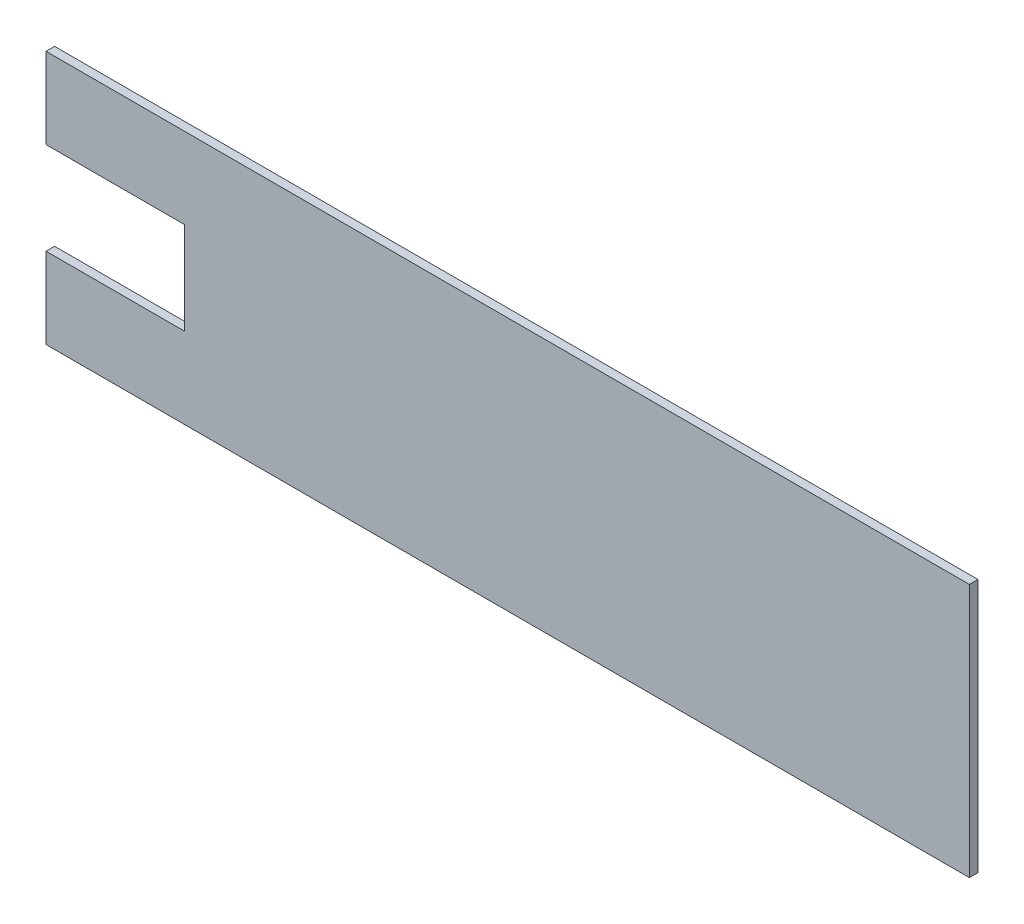
ISO-10303-21;
HEADER;
FILE_DESCRIPTION(('STEP AP214'),'2;1');
FILE_NAME('part.step','',(''),(''),'','','');
FILE_SCHEMA(('AUTOMOTIVE_DESIGN { 1 0 10303 214 1 1 1 1 }'));
ENDSEC;
DATA;
#1=APPLICATION_CONTEXT('core data for automotive mechanical design processes');
#2=APPLICATION_PROTOCOL_DEFINITION('international standard','automotive_design',2000,#1);
#3=PRODUCT_CONTEXT('',#1,'mechanical');
#4=PRODUCT('Part','Part','',(#3));
#5=PRODUCT_RELATED_PRODUCT_CATEGORY('part','',(#4));
#6=PRODUCT_DEFINITION_FORMATION('','',#4);
#7=PRODUCT_DEFINITION_CONTEXT('part definition',#1,'design');
#8=PRODUCT_DEFINITION('design','',#6,#7);
#9=PRODUCT_DEFINITION_SHAPE('','',#8);
#10=(LENGTH_UNIT() NAMED_UNIT(*) SI_UNIT(.MILLI.,.METRE.));
#11=(NAMED_UNIT(*) PLANE_ANGLE_UNIT() SI_UNIT($,.RADIAN.));
#12=(NAMED_UNIT(*) SI_UNIT($,.STERADIAN.) SOLID_ANGLE_UNIT());
#13=UNCERTAINTY_MEASURE_WITH_UNIT(LENGTH_MEASURE(1.E-05),#10,'distance_accuracy_value','');
#14=(GEOMETRIC_REPRESENTATION_CONTEXT(3) GLOBAL_UNCERTAINTY_ASSIGNED_CONTEXT((#13)) GLOBAL_UNIT_ASSIGNED_CONTEXT((#10,
#11,#12)) REPRESENTATION_CONTEXT('',''));
#15=CARTESIAN_POINT('',(0.,0.,0.));
#16=DIRECTION('',(0.,0.,1.));
#17=DIRECTION('',(1.,0.,0.));
#18=AXIS2_PLACEMENT_3D('',#15,#16,#17);
#19=CARTESIAN_POINT('',(0.,0.,2.3622));
#20=DIRECTION('',(1.,0.,0.));
#21=DIRECTION('',(0.,0.,-1.));
#22=AXIS2_PLACEMENT_3D('',#19,#20,#21);
#23=PLANE('',#22);
#24=DIRECTION('',(0.,-1.,0.));
#25=VECTOR('',#24,1.);
#26=CARTESIAN_POINT('',(0.,0.,0.));
#27=LINE('',#26,#25);
#28=CARTESIAN_POINT('',(0.,69.85,0.));
#29=VERTEX_POINT('',#28);
#30=CARTESIAN_POINT('',(0.,47.625,0.));
#31=VERTEX_POINT('',#30);
#32=EDGE_CURVE('E141',#29,#31,#27,.T.);
#33=ORIENTED_EDGE('',*,*,#32,.T.);
#34=DIRECTION('',(0.,0.,1.));
#35=VECTOR('',#34,1.);
#36=CARTESIAN_POINT('',(0.,47.625,0.));
#37=LINE('',#36,#35);
#38=CARTESIAN_POINT('',(0.,47.625,2.3622));
#39=VERTEX_POINT('',#38);
#40=EDGE_CURVE('E142',#31,#39,#37,.T.);
#41=ORIENTED_EDGE('',*,*,#40,.T.);
#42=DIRECTION('',(0.,-1.,0.));
#43=VECTOR('',#42,1.);
#44=CARTESIAN_POINT('',(0.,0.,2.3622));
#45=LINE('',#44,#43);
#46=CARTESIAN_POINT('',(0.,69.85,2.3622));
#47=VERTEX_POINT('',#46);
#48=EDGE_CURVE('E178',#47,#39,#45,.T.);
#49=ORIENTED_EDGE('',*,*,#48,.F.);
#50=DIRECTION('',(0.,0.,-1.));
#51=VECTOR('',#50,1.);
#52=CARTESIAN_POINT('',(0.,69.85,2.3622));
#53=LINE('',#52,#51);
#54=EDGE_CURVE('E160',#47,#29,#53,.T.);
#55=ORIENTED_EDGE('',*,*,#54,.T.);
#56=EDGE_LOOP('',(#33,#41,#49,#55));
#57=FACE_BOUND('',#56,.T.);
#58=ADVANCED_FACE('F43',(#57),#23,.F.);
#59=CARTESIAN_POINT('',(0.,22.225,2.3622));
#60=VERTEX_POINT('',#59);
#61=CARTESIAN_POINT('',(0.,0.,2.3622));
#62=VERTEX_POINT('',#61);
#63=EDGE_CURVE('E96',#60,#62,#45,.T.);
#64=ORIENTED_EDGE('',*,*,#63,.F.);
#65=DIRECTION('',(0.,0.,1.));
#66=VECTOR('',#65,1.);
#67=CARTESIAN_POINT('',(0.,22.225,0.));
#68=LINE('',#67,#66);
#69=CARTESIAN_POINT('',(0.,22.225,0.));
#70=VERTEX_POINT('',#69);
#71=EDGE_CURVE('E122',#70,#60,#68,.T.);
#72=ORIENTED_EDGE('',*,*,#71,.F.);
#73=CARTESIAN_POINT('',(0.,0.,0.));
#74=VERTEX_POINT('',#73);
#75=EDGE_CURVE('E131',#70,#74,#27,.T.);
#76=ORIENTED_EDGE('',*,*,#75,.T.);
#77=DIRECTION('',(0.,0.,-1.));
#78=VECTOR('',#77,1.);
#79=CARTESIAN_POINT('',(0.,0.,2.3622));
#80=LINE('',#79,#78);
#81=EDGE_CURVE('E11',#62,#74,#80,.T.);
#82=ORIENTED_EDGE('',*,*,#81,.F.);
#83=EDGE_LOOP('',(#64,#72,#76,#82));
#84=FACE_BOUND('',#83,.T.);
#85=ADVANCED_FACE('F45',(#84),#23,.F.);
#86=CARTESIAN_POINT('',(0.,0.,2.3622));
#87=DIRECTION('',(0.,1.,0.));
#88=DIRECTION('',(0.,0.,1.));
#89=AXIS2_PLACEMENT_3D('',#86,#87,#88);
#90=PLANE('',#89);
#91=DIRECTION('',(1.,0.,0.));
#92=VECTOR('',#91,1.);
#93=CARTESIAN_POINT('',(0.,0.,0.));
#94=LINE('',#93,#92);
#95=CARTESIAN_POINT('',(254.,0.,0.));
#96=VERTEX_POINT('',#95);
#97=EDGE_CURVE('E139',#74,#96,#94,.T.);
#98=ORIENTED_EDGE('',*,*,#97,.T.);
#99=DIRECTION('',(0.,0.,-1.));
#100=VECTOR('',#99,1.);
#101=CARTESIAN_POINT('',(254.,0.,2.3622));
#102=LINE('',#101,#100);
#103=CARTESIAN_POINT('',(254.,0.,2.3622));
#104=VERTEX_POINT('',#103);
#105=EDGE_CURVE('E52',#104,#96,#102,.T.);
#106=ORIENTED_EDGE('',*,*,#105,.F.);
#107=DIRECTION('',(1.,0.,0.));
#108=VECTOR('',#107,1.);
#109=CARTESIAN_POINT('',(0.,0.,2.3622));
#110=LINE('',#109,#108);
#111=EDGE_CURVE('E182',#62,#104,#110,.T.);
#112=ORIENTED_EDGE('',*,*,#111,.F.);
#113=ORIENTED_EDGE('',*,*,#81,.T.);
#114=EDGE_LOOP('',(#98,#106,#112,#113));
#115=FACE_BOUND('',#114,.T.);
#116=ADVANCED_FACE('F222',(#115),#90,.F.);
#117=CARTESIAN_POINT('',(254.,0.,2.3622));
#118=DIRECTION('',(-1.,0.,0.));
#119=DIRECTION('',(0.,0.,1.));
#120=AXIS2_PLACEMENT_3D('',#117,#118,#119);
#121=PLANE('',#120);
#122=DIRECTION('',(0.,1.,0.));
#123=VECTOR('',#122,1.);
#124=CARTESIAN_POINT('',(254.,0.,0.));
#125=LINE('',#124,#123);
#126=CARTESIAN_POINT('',(254.,69.85,0.));
#127=VERTEX_POINT('',#126);
#128=EDGE_CURVE('E155',#96,#127,#125,.T.);
#129=ORIENTED_EDGE('',*,*,#128,.T.);
#130=DIRECTION('',(0.,0.,-1.));
#131=VECTOR('',#130,1.);
#132=CARTESIAN_POINT('',(254.,69.85,2.3622));
#133=LINE('',#132,#131);
#134=CARTESIAN_POINT('',(254.,69.85,2.3622));
#135=VERTEX_POINT('',#134);
#136=EDGE_CURVE('E163',#135,#127,#133,.T.);
#137=ORIENTED_EDGE('',*,*,#136,.F.);
#138=DIRECTION('',(0.,1.,0.));
#139=VECTOR('',#138,1.);
#140=CARTESIAN_POINT('',(254.,0.,2.3622));
#141=LINE('',#140,#139);
#142=EDGE_CURVE('E172',#104,#135,#141,.T.);
#143=ORIENTED_EDGE('',*,*,#142,.F.);
#144=ORIENTED_EDGE('',*,*,#105,.T.);
#145=EDGE_LOOP('',(#129,#137,#143,#144));
#146=FACE_BOUND('',#145,.T.);
#147=ADVANCED_FACE('F170',(#146),#121,.F.);
#148=CARTESIAN_POINT('',(0.,69.85,2.3622));
#149=DIRECTION('',(0.,-1.,0.));
#150=DIRECTION('',(0.,0.,-1.));
#151=AXIS2_PLACEMENT_3D('',#148,#149,#150);
#152=PLANE('',#151);
#153=DIRECTION('',(-1.,0.,0.));
#154=VECTOR('',#153,1.);
#155=CARTESIAN_POINT('',(0.,69.85,0.));
#156=LINE('',#155,#154);
#157=EDGE_CURVE('E89',#127,#29,#156,.T.);
#158=ORIENTED_EDGE('',*,*,#157,.T.);
#159=ORIENTED_EDGE('',*,*,#54,.F.);
#160=DIRECTION('',(-1.,0.,0.));
#161=VECTOR('',#160,1.);
#162=CARTESIAN_POINT('',(0.,69.85,2.3622));
#163=LINE('',#162,#161);
#164=EDGE_CURVE('E68',#135,#47,#163,.T.);
#165=ORIENTED_EDGE('',*,*,#164,.F.);
#166=ORIENTED_EDGE('',*,*,#136,.T.);
#167=EDGE_LOOP('',(#158,#159,#165,#166));
#168=FACE_BOUND('',#167,.T.);
#169=ADVANCED_FACE('F179',(#168),#152,.F.);
#170=CARTESIAN_POINT('',(0.,0.,2.3622));
#171=DIRECTION('',(0.,0.,-1.));
#172=DIRECTION('',(-1.,0.,0.));
#173=AXIS2_PLACEMENT_3D('',#170,#171,#172);
#174=PLANE('',#173);
#175=ORIENTED_EDGE('',*,*,#48,.T.);
#176=DIRECTION('',(-1.,0.,0.));
#177=VECTOR('',#176,1.);
#178=CARTESIAN_POINT('',(0.,47.625,2.3622));
#179=LINE('',#178,#177);
#180=CARTESIAN_POINT('',(38.1,47.625,2.3622));
#181=VERTEX_POINT('',#180);
#182=EDGE_CURVE('E127',#181,#39,#179,.T.);
#183=ORIENTED_EDGE('',*,*,#182,.F.);
#184=DIRECTION('',(0.,1.,0.));
#185=VECTOR('',#184,1.);
#186=CARTESIAN_POINT('',(38.1,47.625,2.3622));
#187=LINE('',#186,#185);
#188=CARTESIAN_POINT('',(38.1,22.225,2.3622));
#189=VERTEX_POINT('',#188);
#190=EDGE_CURVE('E194',#189,#181,#187,.T.);
#191=ORIENTED_EDGE('',*,*,#190,.F.);
#192=DIRECTION('',(1.,0.,0.));
#193=VECTOR('',#192,1.);
#194=CARTESIAN_POINT('',(0.,22.225,2.3622));
#195=LINE('',#194,#193);
#196=EDGE_CURVE('E198',#60,#189,#195,.T.);
#197=ORIENTED_EDGE('',*,*,#196,.F.);
#198=ORIENTED_EDGE('',*,*,#63,.T.);
#199=ORIENTED_EDGE('',*,*,#111,.T.);
#200=ORIENTED_EDGE('',*,*,#142,.T.);
#201=ORIENTED_EDGE('',*,*,#164,.T.);
#202=EDGE_LOOP('',(#175,#183,#191,#197,#198,#199,#200,#201));
#203=FACE_BOUND('',#202,.T.);
#204=ADVANCED_FACE('F206',(#203),#174,.F.);
#205=CARTESIAN_POINT('',(0.,0.,0.));
#206=DIRECTION('',(0.,0.,-1.));
#207=DIRECTION('',(-1.,0.,0.));
#208=AXIS2_PLACEMENT_3D('',#205,#206,#207);
#209=PLANE('',#208);
#210=DIRECTION('',(-1.,0.,0.));
#211=VECTOR('',#210,1.);
#212=CARTESIAN_POINT('',(0.,47.625,0.));
#213=LINE('',#212,#211);
#214=CARTESIAN_POINT('',(38.1,47.625,0.));
#215=VERTEX_POINT('',#214);
#216=EDGE_CURVE('E134',#215,#31,#213,.T.);
#217=ORIENTED_EDGE('',*,*,#216,.T.);
#218=ORIENTED_EDGE('',*,*,#32,.F.);
#219=ORIENTED_EDGE('',*,*,#157,.F.);
#220=ORIENTED_EDGE('',*,*,#128,.F.);
#221=ORIENTED_EDGE('',*,*,#97,.F.);
#222=ORIENTED_EDGE('',*,*,#75,.F.);
#223=DIRECTION('',(1.,0.,0.));
#224=VECTOR('',#223,1.);
#225=CARTESIAN_POINT('',(0.,22.225,0.));
#226=LINE('',#225,#224);
#227=CARTESIAN_POINT('',(38.1,22.225,0.));
#228=VERTEX_POINT('',#227);
#229=EDGE_CURVE('E118',#70,#228,#226,.T.);
#230=ORIENTED_EDGE('',*,*,#229,.T.);
#231=DIRECTION('',(0.,1.,0.));
#232=VECTOR('',#231,1.);
#233=CARTESIAN_POINT('',(38.1,47.625,0.));
#234=LINE('',#233,#232);
#235=EDGE_CURVE('E59',#228,#215,#234,.T.);
#236=ORIENTED_EDGE('',*,*,#235,.T.);
#237=EDGE_LOOP('',(#217,#218,#219,#220,#221,#222,#230,#236));
#238=FACE_BOUND('',#237,.T.);
#239=ADVANCED_FACE('F137',(#238),#209,.T.);
#240=CARTESIAN_POINT('',(0.,47.625,0.));
#241=DIRECTION('',(0.,1.,0.));
#242=DIRECTION('',(0.,0.,1.));
#243=AXIS2_PLACEMENT_3D('',#240,#241,#242);
#244=PLANE('',#243);
#245=ORIENTED_EDGE('',*,*,#182,.T.);
#246=ORIENTED_EDGE('',*,*,#40,.F.);
#247=ORIENTED_EDGE('',*,*,#216,.F.);
#248=DIRECTION('',(0.,0.,1.));
#249=VECTOR('',#248,1.);
#250=CARTESIAN_POINT('',(38.1,47.625,0.));
#251=LINE('',#250,#249);
#252=EDGE_CURVE('E148',#215,#181,#251,.T.);
#253=ORIENTED_EDGE('',*,*,#252,.T.);
#254=EDGE_LOOP('',(#245,#246,#247,#253));
#255=FACE_BOUND('',#254,.T.);
#256=ADVANCED_FACE('F209',(#255),#244,.F.);
#257=CARTESIAN_POINT('',(38.1,47.625,0.));
#258=DIRECTION('',(1.,0.,0.));
#259=DIRECTION('',(0.,0.,-1.));
#260=AXIS2_PLACEMENT_3D('',#257,#258,#259);
#261=PLANE('',#260);
#262=ORIENTED_EDGE('',*,*,#190,.T.);
#263=ORIENTED_EDGE('',*,*,#252,.F.);
#264=ORIENTED_EDGE('',*,*,#235,.F.);
#265=DIRECTION('',(0.,0.,1.));
#266=VECTOR('',#265,1.);
#267=CARTESIAN_POINT('',(38.1,22.225,0.));
#268=LINE('',#267,#266);
#269=EDGE_CURVE('E123',#228,#189,#268,.T.);
#270=ORIENTED_EDGE('',*,*,#269,.T.);
#271=EDGE_LOOP('',(#262,#263,#264,#270));
#272=FACE_BOUND('',#271,.T.);
#273=ADVANCED_FACE('F207',(#272),#261,.F.);
#274=CARTESIAN_POINT('',(0.,22.225,0.));
#275=DIRECTION('',(0.,-1.,0.));
#276=DIRECTION('',(0.,0.,-1.));
#277=AXIS2_PLACEMENT_3D('',#274,#275,#276);
#278=PLANE('',#277);
#279=ORIENTED_EDGE('',*,*,#196,.T.);
#280=ORIENTED_EDGE('',*,*,#269,.F.);
#281=ORIENTED_EDGE('',*,*,#229,.F.);
#282=ORIENTED_EDGE('',*,*,#71,.T.);
#283=EDGE_LOOP('',(#279,#280,#281,#282));
#284=FACE_BOUND('',#283,.T.);
#285=ADVANCED_FACE('F121',(#284),#278,.F.);
#286=CLOSED_SHELL('',(#58,#85,#116,#147,#169,#204,#239,#256,#273,#285));
#287=MANIFOLD_SOLID_BREP('B2',#286);
#288=ADVANCED_BREP_SHAPE_REPRESENTATION('',(#18,#287),#14);
#289=SHAPE_DEFINITION_REPRESENTATION(#9,#288);
ENDSEC;
END-ISO-10303-21;
